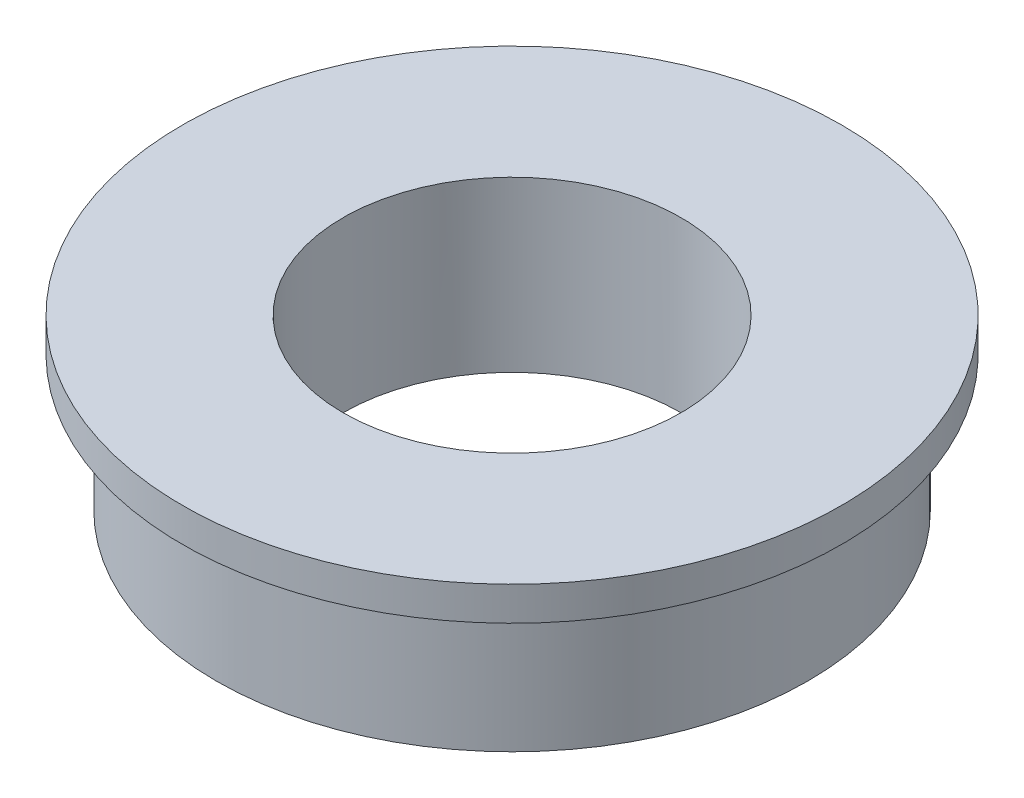
ISO-10303-21;
HEADER;
FILE_DESCRIPTION(('STEP AP214'),'2;1');
FILE_NAME('part.step','',(''),(''),'','','');
FILE_SCHEMA(('AUTOMOTIVE_DESIGN { 1 0 10303 214 1 1 1 1 }'));
ENDSEC;
DATA;
#1=APPLICATION_CONTEXT('core data for automotive mechanical design processes');
#2=APPLICATION_PROTOCOL_DEFINITION('international standard','automotive_design',2000,#1);
#3=PRODUCT_CONTEXT('',#1,'mechanical');
#4=PRODUCT('Part','Part','',(#3));
#5=PRODUCT_RELATED_PRODUCT_CATEGORY('part','',(#4));
#6=PRODUCT_DEFINITION_FORMATION('','',#4);
#7=PRODUCT_DEFINITION_CONTEXT('part definition',#1,'design');
#8=PRODUCT_DEFINITION('design','',#6,#7);
#9=PRODUCT_DEFINITION_SHAPE('','',#8);
#10=(LENGTH_UNIT() NAMED_UNIT(*) SI_UNIT(.MILLI.,.METRE.));
#11=(NAMED_UNIT(*) PLANE_ANGLE_UNIT() SI_UNIT($,.RADIAN.));
#12=(NAMED_UNIT(*) SI_UNIT($,.STERADIAN.) SOLID_ANGLE_UNIT());
#13=UNCERTAINTY_MEASURE_WITH_UNIT(LENGTH_MEASURE(1.E-05),#10,'distance_accuracy_value','');
#14=(GEOMETRIC_REPRESENTATION_CONTEXT(3) GLOBAL_UNCERTAINTY_ASSIGNED_CONTEXT((#13)) GLOBAL_UNIT_ASSIGNED_CONTEXT((#10,
#11,#12)) REPRESENTATION_CONTEXT('',''));
#15=CARTESIAN_POINT('',(0.,0.,0.));
#16=DIRECTION('',(0.,0.,1.));
#17=DIRECTION('',(1.,0.,0.));
#18=AXIS2_PLACEMENT_3D('',#15,#16,#17);
#19=CARTESIAN_POINT('',(0.,4.,0.));
#20=DIRECTION('',(0.,1.,0.));
#21=DIRECTION('',(0.,0.,1.));
#22=AXIS2_PLACEMENT_3D('',#19,#20,#21);
#23=PLANE('',#22);
#24=CARTESIAN_POINT('',(0.,4.,0.));
#25=DIRECTION('',(0.,1.,0.));
#26=DIRECTION('',(0.,0.,1.));
#27=AXIS2_PLACEMENT_3D('',#24,#25,#26);
#28=CIRCLE('',#27,4.);
#29=CARTESIAN_POINT('',(0.,4.,4.));
#30=VERTEX_POINT('',#29);
#31=EDGE_CURVE('E64',#30,#30,#28,.T.);
#32=ORIENTED_EDGE('',*,*,#31,.F.);
#33=EDGE_LOOP('',(#32));
#34=FACE_BOUND('',#33,.T.);
#35=CARTESIAN_POINT('',(0.,4.,0.));
#36=DIRECTION('',(0.,-1.,0.));
#37=DIRECTION('',(0.,0.,-1.));
#38=AXIS2_PLACEMENT_3D('',#35,#36,#37);
#39=CIRCLE('',#38,7.8);
#40=CARTESIAN_POINT('',(0.,4.,-7.8));
#41=VERTEX_POINT('',#40);
#42=EDGE_CURVE('E10',#41,#41,#39,.T.);
#43=ORIENTED_EDGE('',*,*,#42,.F.);
#44=EDGE_LOOP('',(#43));
#45=FACE_BOUND('',#44,.T.);
#46=ADVANCED_FACE('F41',(#34,#45),#23,.T.);
#47=CARTESIAN_POINT('',(0.,0.,0.));
#48=DIRECTION('',(0.,-1.,0.));
#49=DIRECTION('',(0.,0.,-1.));
#50=AXIS2_PLACEMENT_3D('',#47,#48,#49);
#51=CYLINDRICAL_SURFACE('',#50,7.8);
#52=ORIENTED_EDGE('',*,*,#42,.T.);
#53=EDGE_LOOP('',(#52));
#54=FACE_BOUND('',#53,.T.);
#55=CARTESIAN_POINT('',(0.,3.2,0.));
#56=DIRECTION('',(0.,-1.,0.));
#57=DIRECTION('',(0.,0.,-1.));
#58=AXIS2_PLACEMENT_3D('',#55,#56,#57);
#59=CIRCLE('',#58,7.8);
#60=CARTESIAN_POINT('',(0.,3.2,-7.8));
#61=VERTEX_POINT('',#60);
#62=EDGE_CURVE('E48',#61,#61,#59,.T.);
#63=ORIENTED_EDGE('',*,*,#62,.F.);
#64=EDGE_LOOP('',(#63));
#65=FACE_BOUND('',#64,.T.);
#66=ADVANCED_FACE('F77',(#54,#65),#51,.T.);
#67=CARTESIAN_POINT('',(7.8,3.2,0.));
#68=DIRECTION('',(0.,-1.,0.));
#69=DIRECTION('',(0.,0.,-1.));
#70=AXIS2_PLACEMENT_3D('',#67,#68,#69);
#71=PLANE('',#70);
#72=ORIENTED_EDGE('',*,*,#62,.T.);
#73=EDGE_LOOP('',(#72));
#74=FACE_BOUND('',#73,.T.);
#75=CARTESIAN_POINT('',(0.,3.2,0.));
#76=DIRECTION('',(0.,-1.,0.));
#77=DIRECTION('',(0.,0.,-1.));
#78=AXIS2_PLACEMENT_3D('',#75,#76,#77);
#79=CIRCLE('',#78,7.);
#80=CARTESIAN_POINT('',(0.,3.2,-7.));
#81=VERTEX_POINT('',#80);
#82=EDGE_CURVE('E54',#81,#81,#79,.T.);
#83=ORIENTED_EDGE('',*,*,#82,.F.);
#84=EDGE_LOOP('',(#83));
#85=FACE_BOUND('',#84,.T.);
#86=ADVANCED_FACE('F80',(#74,#85),#71,.T.);
#87=CARTESIAN_POINT('',(0.,0.,0.));
#88=DIRECTION('',(0.,-1.,0.));
#89=DIRECTION('',(0.,0.,-1.));
#90=AXIS2_PLACEMENT_3D('',#87,#88,#89);
#91=CYLINDRICAL_SURFACE('',#90,7.);
#92=ORIENTED_EDGE('',*,*,#82,.T.);
#93=EDGE_LOOP('',(#92));
#94=FACE_BOUND('',#93,.T.);
#95=CARTESIAN_POINT('',(0.,0.,0.));
#96=DIRECTION('',(0.,-1.,0.));
#97=DIRECTION('',(0.,0.,-1.));
#98=AXIS2_PLACEMENT_3D('',#95,#96,#97);
#99=CIRCLE('',#98,7.);
#100=CARTESIAN_POINT('',(0.,0.,-7.));
#101=VERTEX_POINT('',#100);
#102=EDGE_CURVE('E59',#101,#101,#99,.T.);
#103=ORIENTED_EDGE('',*,*,#102,.F.);
#104=EDGE_LOOP('',(#103));
#105=FACE_BOUND('',#104,.T.);
#106=ADVANCED_FACE('F83',(#94,#105),#91,.T.);
#107=CARTESIAN_POINT('',(7.,0.,0.));
#108=DIRECTION('',(0.,-1.,0.));
#109=DIRECTION('',(0.,0.,-1.));
#110=AXIS2_PLACEMENT_3D('',#107,#108,#109);
#111=PLANE('',#110);
#112=CARTESIAN_POINT('',(0.,0.,0.));
#113=DIRECTION('',(0.,-1.,0.));
#114=DIRECTION('',(0.,0.,-1.));
#115=AXIS2_PLACEMENT_3D('',#112,#113,#114);
#116=CIRCLE('',#115,4.);
#117=CARTESIAN_POINT('',(0.,0.,-4.));
#118=VERTEX_POINT('',#117);
#119=EDGE_CURVE('E65',#118,#118,#116,.F.);
#120=ORIENTED_EDGE('',*,*,#119,.T.);
#121=EDGE_LOOP('',(#120));
#122=FACE_BOUND('',#121,.T.);
#123=ORIENTED_EDGE('',*,*,#102,.T.);
#124=EDGE_LOOP('',(#123));
#125=FACE_BOUND('',#124,.T.);
#126=ADVANCED_FACE('F89',(#122,#125),#111,.T.);
#127=CARTESIAN_POINT('',(0.,-0.00100000000000013,0.));
#128=DIRECTION('',(0.,1.,0.));
#129=DIRECTION('',(0.,0.,1.));
#130=AXIS2_PLACEMENT_3D('',#127,#128,#129);
#131=CYLINDRICAL_SURFACE('',#130,4.);
#132=ORIENTED_EDGE('',*,*,#119,.F.);
#133=EDGE_LOOP('',(#132));
#134=FACE_BOUND('',#133,.T.);
#135=ORIENTED_EDGE('',*,*,#31,.T.);
#136=EDGE_LOOP('',(#135));
#137=FACE_BOUND('',#136,.T.);
#138=ADVANCED_FACE('F73',(#134,#137),#131,.F.);
#139=CLOSED_SHELL('',(#46,#66,#86,#106,#126,#138));
#140=MANIFOLD_SOLID_BREP('B2',#139);
#141=ADVANCED_BREP_SHAPE_REPRESENTATION('',(#18,#140),#14);
#142=SHAPE_DEFINITION_REPRESENTATION(#9,#141);
ENDSEC;
END-ISO-10303-21;
